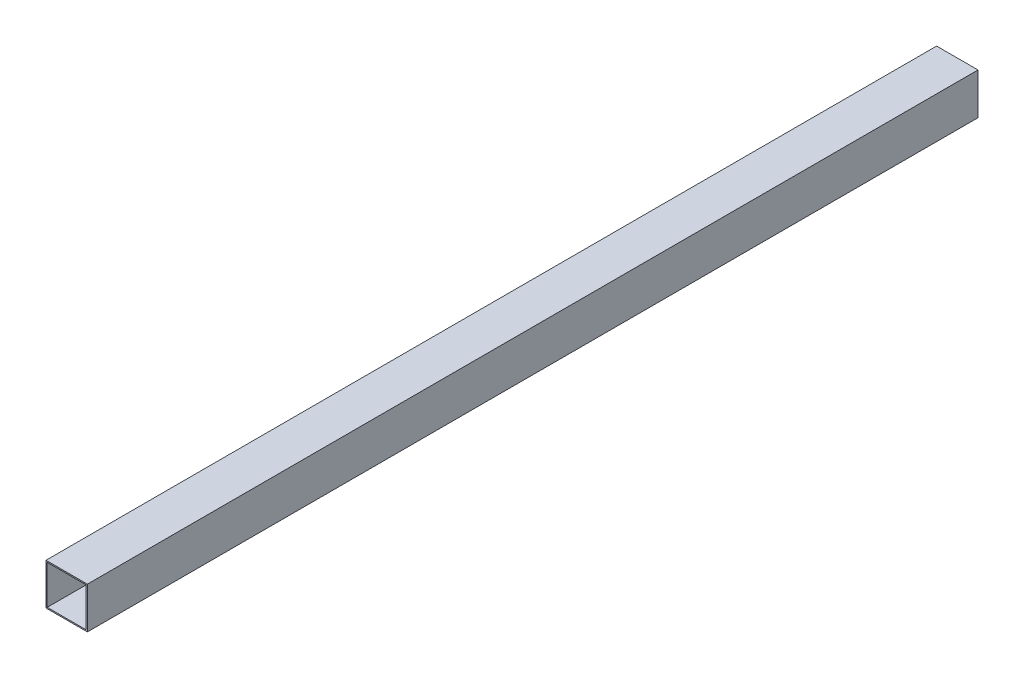
ISO-10303-21;
HEADER;
FILE_DESCRIPTION(('STEP AP214'),'2;1');
FILE_NAME('part.step','',(''),(''),'','','');
FILE_SCHEMA(('AUTOMOTIVE_DESIGN { 1 0 10303 214 1 1 1 1 }'));
ENDSEC;
DATA;
#1=APPLICATION_CONTEXT('core data for automotive mechanical design processes');
#2=APPLICATION_PROTOCOL_DEFINITION('international standard','automotive_design',2000,#1);
#3=PRODUCT_CONTEXT('',#1,'mechanical');
#4=PRODUCT('Part','Part','',(#3));
#5=PRODUCT_RELATED_PRODUCT_CATEGORY('part','',(#4));
#6=PRODUCT_DEFINITION_FORMATION('','',#4);
#7=PRODUCT_DEFINITION_CONTEXT('part definition',#1,'design');
#8=PRODUCT_DEFINITION('design','',#6,#7);
#9=PRODUCT_DEFINITION_SHAPE('','',#8);
#10=(LENGTH_UNIT() NAMED_UNIT(*) SI_UNIT(.MILLI.,.METRE.));
#11=(NAMED_UNIT(*) PLANE_ANGLE_UNIT() SI_UNIT($,.RADIAN.));
#12=(NAMED_UNIT(*) SI_UNIT($,.STERADIAN.) SOLID_ANGLE_UNIT());
#13=UNCERTAINTY_MEASURE_WITH_UNIT(LENGTH_MEASURE(1.E-05),#10,'distance_accuracy_value','');
#14=(GEOMETRIC_REPRESENTATION_CONTEXT(3) GLOBAL_UNCERTAINTY_ASSIGNED_CONTEXT((#13)) GLOBAL_UNIT_ASSIGNED_CONTEXT((#10,
#11,#12)) REPRESENTATION_CONTEXT('',''));
#15=CARTESIAN_POINT('',(0.,0.,0.));
#16=DIRECTION('',(0.,0.,1.));
#17=DIRECTION('',(1.,0.,0.));
#18=AXIS2_PLACEMENT_3D('',#15,#16,#17);
#19=CARTESIAN_POINT('',(0.,0.,1828.8));
#20=DIRECTION('',(0.,0.,1.));
#21=DIRECTION('',(1.,0.,0.));
#22=AXIS2_PLACEMENT_3D('',#19,#20,#21);
#23=PLANE('',#22);
#24=DIRECTION('',(0.,-1.,0.));
#25=VECTOR('',#24,1.);
#26=CARTESIAN_POINT('',(-42.5,-42.5000000000001,1828.8));
#27=LINE('',#26,#25);
#28=CARTESIAN_POINT('',(-42.5,42.5,1828.8));
#29=VERTEX_POINT('',#28);
#30=CARTESIAN_POINT('',(-42.5,-42.5000000000001,1828.8));
#31=VERTEX_POINT('',#30);
#32=EDGE_CURVE('E134',#29,#31,#27,.T.);
#33=ORIENTED_EDGE('',*,*,#32,.T.);
#34=DIRECTION('',(1.,0.,0.));
#35=VECTOR('',#34,1.);
#36=CARTESIAN_POINT('',(42.5,-42.5000000000001,1828.8));
#37=LINE('',#36,#35);
#38=CARTESIAN_POINT('',(42.5,-42.5000000000001,1828.8));
#39=VERTEX_POINT('',#38);
#40=EDGE_CURVE('E137',#31,#39,#37,.T.);
#41=ORIENTED_EDGE('',*,*,#40,.T.);
#42=DIRECTION('',(0.,1.,0.));
#43=VECTOR('',#42,1.);
#44=CARTESIAN_POINT('',(42.5,-42.5000000000001,1828.8));
#45=LINE('',#44,#43);
#46=CARTESIAN_POINT('',(42.5,42.5,1828.8));
#47=VERTEX_POINT('',#46);
#48=EDGE_CURVE('E140',#39,#47,#45,.T.);
#49=ORIENTED_EDGE('',*,*,#48,.T.);
#50=DIRECTION('',(-1.,0.,0.));
#51=VECTOR('',#50,1.);
#52=CARTESIAN_POINT('',(42.5,42.5,1828.8));
#53=LINE('',#52,#51);
#54=EDGE_CURVE('E142',#47,#29,#53,.T.);
#55=ORIENTED_EDGE('',*,*,#54,.T.);
#56=EDGE_LOOP('',(#33,#41,#49,#55));
#57=FACE_BOUND('',#56,.T.);
#58=DIRECTION('',(0.,1.,0.));
#59=VECTOR('',#58,1.);
#60=CARTESIAN_POINT('',(40.,-40.0000000000001,1828.8));
#61=LINE('',#60,#59);
#62=CARTESIAN_POINT('',(40.,-40.0000000000001,1828.8));
#63=VERTEX_POINT('',#62);
#64=CARTESIAN_POINT('',(40.,40.,1828.8));
#65=VERTEX_POINT('',#64);
#66=EDGE_CURVE('E106',#63,#65,#61,.T.);
#67=ORIENTED_EDGE('',*,*,#66,.F.);
#68=DIRECTION('',(1.,0.,0.));
#69=VECTOR('',#68,1.);
#70=CARTESIAN_POINT('',(40.,-40.0000000000001,1828.8));
#71=LINE('',#70,#69);
#72=CARTESIAN_POINT('',(-40.,-40.0000000000001,1828.8));
#73=VERTEX_POINT('',#72);
#74=EDGE_CURVE('E98',#73,#63,#71,.T.);
#75=ORIENTED_EDGE('',*,*,#74,.F.);
#76=DIRECTION('',(0.,-1.,0.));
#77=VECTOR('',#76,1.);
#78=CARTESIAN_POINT('',(-40.,-40.0000000000001,1828.8));
#79=LINE('',#78,#77);
#80=CARTESIAN_POINT('',(-40.,40.,1828.8));
#81=VERTEX_POINT('',#80);
#82=EDGE_CURVE('E120',#81,#73,#79,.T.);
#83=ORIENTED_EDGE('',*,*,#82,.F.);
#84=DIRECTION('',(-1.,0.,0.));
#85=VECTOR('',#84,1.);
#86=CARTESIAN_POINT('',(40.,40.,1828.8));
#87=LINE('',#86,#85);
#88=EDGE_CURVE('E118',#65,#81,#87,.T.);
#89=ORIENTED_EDGE('',*,*,#88,.F.);
#90=EDGE_LOOP('',(#67,#75,#83,#89));
#91=FACE_BOUND('',#90,.T.);
#92=ADVANCED_FACE('F33',(#57,#91),#23,.T.);
#93=CARTESIAN_POINT('',(0.,0.,0.));
#94=DIRECTION('',(0.,0.,1.));
#95=DIRECTION('',(1.,0.,0.));
#96=AXIS2_PLACEMENT_3D('',#93,#94,#95);
#97=PLANE('',#96);
#98=DIRECTION('',(0.,-1.,0.));
#99=VECTOR('',#98,1.);
#100=CARTESIAN_POINT('',(-42.5,-42.5000000000001,0.));
#101=LINE('',#100,#99);
#102=CARTESIAN_POINT('',(-42.5,42.5,0.));
#103=VERTEX_POINT('',#102);
#104=CARTESIAN_POINT('',(-42.5,-42.5000000000001,0.));
#105=VERTEX_POINT('',#104);
#106=EDGE_CURVE('E114',#103,#105,#101,.T.);
#107=ORIENTED_EDGE('',*,*,#106,.F.);
#108=DIRECTION('',(-1.,0.,0.));
#109=VECTOR('',#108,1.);
#110=CARTESIAN_POINT('',(42.5,42.5,0.));
#111=LINE('',#110,#109);
#112=CARTESIAN_POINT('',(42.5,42.5,0.));
#113=VERTEX_POINT('',#112);
#114=EDGE_CURVE('E138',#113,#103,#111,.T.);
#115=ORIENTED_EDGE('',*,*,#114,.F.);
#116=DIRECTION('',(0.,1.,0.));
#117=VECTOR('',#116,1.);
#118=CARTESIAN_POINT('',(42.5,-42.5000000000001,0.));
#119=LINE('',#118,#117);
#120=CARTESIAN_POINT('',(42.5,-42.5000000000001,0.));
#121=VERTEX_POINT('',#120);
#122=EDGE_CURVE('E149',#121,#113,#119,.T.);
#123=ORIENTED_EDGE('',*,*,#122,.F.);
#124=DIRECTION('',(1.,0.,0.));
#125=VECTOR('',#124,1.);
#126=CARTESIAN_POINT('',(42.5,-42.5000000000001,0.));
#127=LINE('',#126,#125);
#128=EDGE_CURVE('E147',#105,#121,#127,.T.);
#129=ORIENTED_EDGE('',*,*,#128,.F.);
#130=EDGE_LOOP('',(#107,#115,#123,#129));
#131=FACE_BOUND('',#130,.T.);
#132=DIRECTION('',(1.,0.,0.));
#133=VECTOR('',#132,1.);
#134=CARTESIAN_POINT('',(40.,-40.0000000000001,0.));
#135=LINE('',#134,#133);
#136=CARTESIAN_POINT('',(-40.,-40.0000000000001,0.));
#137=VERTEX_POINT('',#136);
#138=CARTESIAN_POINT('',(40.,-40.0000000000001,0.));
#139=VERTEX_POINT('',#138);
#140=EDGE_CURVE('E56',#137,#139,#135,.T.);
#141=ORIENTED_EDGE('',*,*,#140,.T.);
#142=DIRECTION('',(0.,1.,0.));
#143=VECTOR('',#142,1.);
#144=CARTESIAN_POINT('',(40.,-40.0000000000001,0.));
#145=LINE('',#144,#143);
#146=CARTESIAN_POINT('',(40.,40.,0.));
#147=VERTEX_POINT('',#146);
#148=EDGE_CURVE('E113',#139,#147,#145,.T.);
#149=ORIENTED_EDGE('',*,*,#148,.T.);
#150=DIRECTION('',(-1.,0.,0.));
#151=VECTOR('',#150,1.);
#152=CARTESIAN_POINT('',(40.,40.,0.));
#153=LINE('',#152,#151);
#154=CARTESIAN_POINT('',(-40.,40.,0.));
#155=VERTEX_POINT('',#154);
#156=EDGE_CURVE('E126',#147,#155,#153,.T.);
#157=ORIENTED_EDGE('',*,*,#156,.T.);
#158=DIRECTION('',(0.,-1.,0.));
#159=VECTOR('',#158,1.);
#160=CARTESIAN_POINT('',(-40.,-40.0000000000001,0.));
#161=LINE('',#160,#159);
#162=EDGE_CURVE('E107',#155,#137,#161,.T.);
#163=ORIENTED_EDGE('',*,*,#162,.T.);
#164=EDGE_LOOP('',(#141,#149,#157,#163));
#165=FACE_BOUND('',#164,.T.);
#166=ADVANCED_FACE('F167',(#131,#165),#97,.F.);
#167=CARTESIAN_POINT('',(-42.5,-42.5000000000001,1828.8));
#168=DIRECTION('',(1.,0.,0.));
#169=DIRECTION('',(0.,0.,-1.));
#170=AXIS2_PLACEMENT_3D('',#167,#168,#169);
#171=PLANE('',#170);
#172=ORIENTED_EDGE('',*,*,#106,.T.);
#173=DIRECTION('',(0.,0.,-1.));
#174=VECTOR('',#173,1.);
#175=CARTESIAN_POINT('',(-42.5,-42.5000000000001,1828.8));
#176=LINE('',#175,#174);
#177=EDGE_CURVE('E11',#31,#105,#176,.T.);
#178=ORIENTED_EDGE('',*,*,#177,.F.);
#179=ORIENTED_EDGE('',*,*,#32,.F.);
#180=DIRECTION('',(0.,0.,-1.));
#181=VECTOR('',#180,1.);
#182=CARTESIAN_POINT('',(-42.5,42.5,1828.8));
#183=LINE('',#182,#181);
#184=EDGE_CURVE('E144',#29,#103,#183,.T.);
#185=ORIENTED_EDGE('',*,*,#184,.T.);
#186=EDGE_LOOP('',(#172,#178,#179,#185));
#187=FACE_BOUND('',#186,.T.);
#188=ADVANCED_FACE('F35',(#187),#171,.F.);
#189=CARTESIAN_POINT('',(42.5,-42.5000000000001,1828.8));
#190=DIRECTION('',(0.,1.,0.));
#191=DIRECTION('',(0.,0.,1.));
#192=AXIS2_PLACEMENT_3D('',#189,#190,#191);
#193=PLANE('',#192);
#194=ORIENTED_EDGE('',*,*,#128,.T.);
#195=DIRECTION('',(0.,0.,-1.));
#196=VECTOR('',#195,1.);
#197=CARTESIAN_POINT('',(42.5,-42.5000000000001,1828.8));
#198=LINE('',#197,#196);
#199=EDGE_CURVE('E41',#39,#121,#198,.T.);
#200=ORIENTED_EDGE('',*,*,#199,.F.);
#201=ORIENTED_EDGE('',*,*,#40,.F.);
#202=ORIENTED_EDGE('',*,*,#177,.T.);
#203=EDGE_LOOP('',(#194,#200,#201,#202));
#204=FACE_BOUND('',#203,.T.);
#205=ADVANCED_FACE('F177',(#204),#193,.F.);
#206=CARTESIAN_POINT('',(42.5,-42.5000000000001,1828.8));
#207=DIRECTION('',(-1.,0.,0.));
#208=DIRECTION('',(0.,0.,1.));
#209=AXIS2_PLACEMENT_3D('',#206,#207,#208);
#210=PLANE('',#209);
#211=ORIENTED_EDGE('',*,*,#122,.T.);
#212=DIRECTION('',(0.,0.,-1.));
#213=VECTOR('',#212,1.);
#214=CARTESIAN_POINT('',(42.5,42.5,1828.8));
#215=LINE('',#214,#213);
#216=EDGE_CURVE('E154',#47,#113,#215,.T.);
#217=ORIENTED_EDGE('',*,*,#216,.F.);
#218=ORIENTED_EDGE('',*,*,#48,.F.);
#219=ORIENTED_EDGE('',*,*,#199,.T.);
#220=EDGE_LOOP('',(#211,#217,#218,#219));
#221=FACE_BOUND('',#220,.T.);
#222=ADVANCED_FACE('F161',(#221),#210,.F.);
#223=CARTESIAN_POINT('',(42.5,42.5,1828.8));
#224=DIRECTION('',(0.,-1.,0.));
#225=DIRECTION('',(0.,0.,-1.));
#226=AXIS2_PLACEMENT_3D('',#223,#224,#225);
#227=PLANE('',#226);
#228=ORIENTED_EDGE('',*,*,#114,.T.);
#229=ORIENTED_EDGE('',*,*,#184,.F.);
#230=ORIENTED_EDGE('',*,*,#54,.F.);
#231=ORIENTED_EDGE('',*,*,#216,.T.);
#232=EDGE_LOOP('',(#228,#229,#230,#231));
#233=FACE_BOUND('',#232,.T.);
#234=ADVANCED_FACE('F171',(#233),#227,.F.);
#235=CARTESIAN_POINT('',(40.,-40.0000000000001,1828.8));
#236=DIRECTION('',(0.,1.,0.));
#237=DIRECTION('',(0.,0.,1.));
#238=AXIS2_PLACEMENT_3D('',#235,#236,#237);
#239=PLANE('',#238);
#240=ORIENTED_EDGE('',*,*,#140,.F.);
#241=DIRECTION('',(0.,0.,-1.));
#242=VECTOR('',#241,1.);
#243=CARTESIAN_POINT('',(-40.,-40.0000000000001,1828.8));
#244=LINE('',#243,#242);
#245=EDGE_CURVE('E102',#73,#137,#244,.T.);
#246=ORIENTED_EDGE('',*,*,#245,.F.);
#247=ORIENTED_EDGE('',*,*,#74,.T.);
#248=DIRECTION('',(0.,0.,-1.));
#249=VECTOR('',#248,1.);
#250=CARTESIAN_POINT('',(40.,-40.0000000000001,1828.8));
#251=LINE('',#250,#249);
#252=EDGE_CURVE('E101',#63,#139,#251,.T.);
#253=ORIENTED_EDGE('',*,*,#252,.T.);
#254=EDGE_LOOP('',(#240,#246,#247,#253));
#255=FACE_BOUND('',#254,.T.);
#256=ADVANCED_FACE('F100',(#255),#239,.T.);
#257=CARTESIAN_POINT('',(40.,-40.0000000000001,1828.8));
#258=DIRECTION('',(-1.,0.,0.));
#259=DIRECTION('',(0.,0.,1.));
#260=AXIS2_PLACEMENT_3D('',#257,#258,#259);
#261=PLANE('',#260);
#262=ORIENTED_EDGE('',*,*,#148,.F.);
#263=ORIENTED_EDGE('',*,*,#252,.F.);
#264=ORIENTED_EDGE('',*,*,#66,.T.);
#265=DIRECTION('',(0.,0.,-1.));
#266=VECTOR('',#265,1.);
#267=CARTESIAN_POINT('',(40.,40.,1828.8));
#268=LINE('',#267,#266);
#269=EDGE_CURVE('E115',#65,#147,#268,.T.);
#270=ORIENTED_EDGE('',*,*,#269,.T.);
#271=EDGE_LOOP('',(#262,#263,#264,#270));
#272=FACE_BOUND('',#271,.T.);
#273=ADVANCED_FACE('F110',(#272),#261,.T.);
#274=CARTESIAN_POINT('',(40.,40.,1828.8));
#275=DIRECTION('',(0.,-1.,0.));
#276=DIRECTION('',(0.,0.,-1.));
#277=AXIS2_PLACEMENT_3D('',#274,#275,#276);
#278=PLANE('',#277);
#279=ORIENTED_EDGE('',*,*,#156,.F.);
#280=ORIENTED_EDGE('',*,*,#269,.F.);
#281=ORIENTED_EDGE('',*,*,#88,.T.);
#282=DIRECTION('',(0.,0.,-1.));
#283=VECTOR('',#282,1.);
#284=CARTESIAN_POINT('',(-40.,40.,1828.8));
#285=LINE('',#284,#283);
#286=EDGE_CURVE('E48',#81,#155,#285,.T.);
#287=ORIENTED_EDGE('',*,*,#286,.T.);
#288=EDGE_LOOP('',(#279,#280,#281,#287));
#289=FACE_BOUND('',#288,.T.);
#290=ADVANCED_FACE('F200',(#289),#278,.T.);
#291=CARTESIAN_POINT('',(-40.,-40.0000000000001,1828.8));
#292=DIRECTION('',(1.,0.,0.));
#293=DIRECTION('',(0.,0.,-1.));
#294=AXIS2_PLACEMENT_3D('',#291,#292,#293);
#295=PLANE('',#294);
#296=ORIENTED_EDGE('',*,*,#162,.F.);
#297=ORIENTED_EDGE('',*,*,#286,.F.);
#298=ORIENTED_EDGE('',*,*,#82,.T.);
#299=ORIENTED_EDGE('',*,*,#245,.T.);
#300=EDGE_LOOP('',(#296,#297,#298,#299));
#301=FACE_BOUND('',#300,.T.);
#302=ADVANCED_FACE('F204',(#301),#295,.T.);
#303=CLOSED_SHELL('',(#92,#166,#188,#205,#222,#234,#256,#273,#290,#302));
#304=MANIFOLD_SOLID_BREP('B2',#303);
#305=ADVANCED_BREP_SHAPE_REPRESENTATION('',(#18,#304),#14);
#306=SHAPE_DEFINITION_REPRESENTATION(#9,#305);
ENDSEC;
END-ISO-10303-21;
